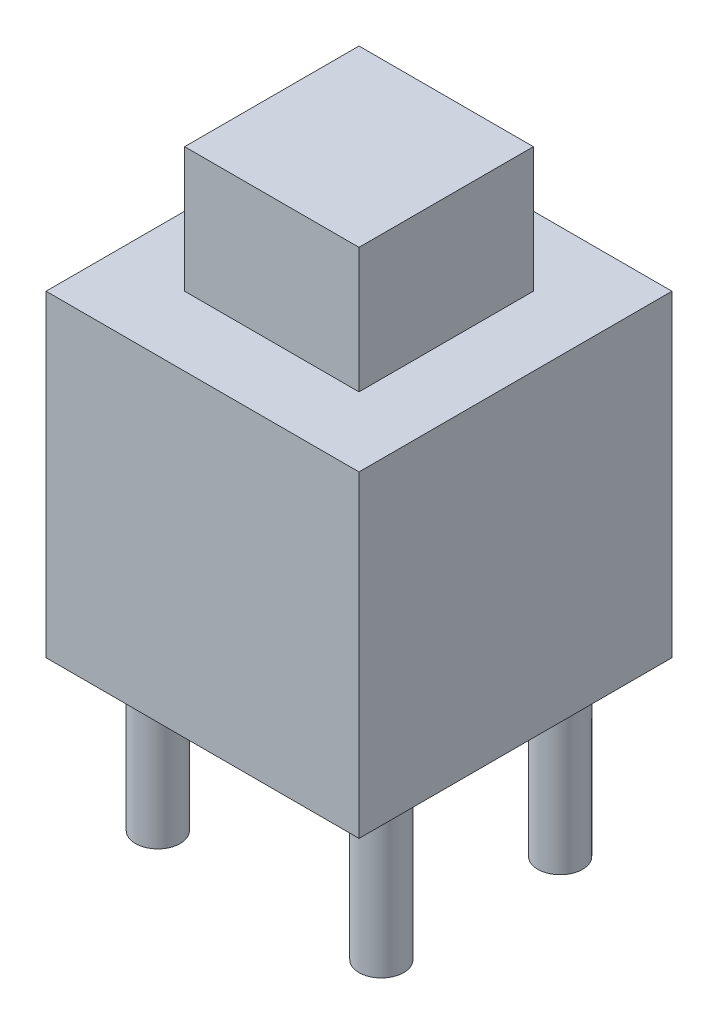
ISO-10303-21;
HEADER;
FILE_DESCRIPTION(('STEP AP214'),'2;1');
FILE_NAME('part.step','',(''),(''),'','','');
FILE_SCHEMA(('AUTOMOTIVE_DESIGN { 1 0 10303 214 1 1 1 1 }'));
ENDSEC;
DATA;
#1=APPLICATION_CONTEXT('core data for automotive mechanical design processes');
#2=APPLICATION_PROTOCOL_DEFINITION('international standard','automotive_design',2000,#1);
#3=PRODUCT_CONTEXT('',#1,'mechanical');
#4=PRODUCT('Part','Part','',(#3));
#5=PRODUCT_RELATED_PRODUCT_CATEGORY('part','',(#4));
#6=PRODUCT_DEFINITION_FORMATION('','',#4);
#7=PRODUCT_DEFINITION_CONTEXT('part definition',#1,'design');
#8=PRODUCT_DEFINITION('design','',#6,#7);
#9=PRODUCT_DEFINITION_SHAPE('','',#8);
#10=(LENGTH_UNIT() NAMED_UNIT(*) SI_UNIT(.MILLI.,.METRE.));
#11=(NAMED_UNIT(*) PLANE_ANGLE_UNIT() SI_UNIT($,.RADIAN.));
#12=(NAMED_UNIT(*) SI_UNIT($,.STERADIAN.) SOLID_ANGLE_UNIT());
#13=UNCERTAINTY_MEASURE_WITH_UNIT(LENGTH_MEASURE(1.E-05),#10,'distance_accuracy_value','');
#14=(GEOMETRIC_REPRESENTATION_CONTEXT(3) GLOBAL_UNCERTAINTY_ASSIGNED_CONTEXT((#13)) GLOBAL_UNIT_ASSIGNED_CONTEXT((#10,
#11,#12)) REPRESENTATION_CONTEXT('',''));
#15=CARTESIAN_POINT('',(0.,0.,0.));
#16=DIRECTION('',(0.,0.,1.));
#17=DIRECTION('',(1.,0.,0.));
#18=AXIS2_PLACEMENT_3D('',#15,#16,#17);
#19=CARTESIAN_POINT('',(0.,7.1,0.));
#20=DIRECTION('',(0.,-1.,0.));
#21=DIRECTION('',(0.,0.,-1.));
#22=AXIS2_PLACEMENT_3D('',#19,#20,#21);
#23=PLANE('',#22);
#24=DIRECTION('',(0.,0.,1.));
#25=VECTOR('',#24,1.);
#26=CARTESIAN_POINT('',(0.,7.1,0.));
#27=LINE('',#26,#25);
#28=CARTESIAN_POINT('',(0.,7.1,-7.));
#29=VERTEX_POINT('',#28);
#30=CARTESIAN_POINT('',(0.,7.1,0.));
#31=VERTEX_POINT('',#30);
#32=EDGE_CURVE('E133',#29,#31,#27,.T.);
#33=ORIENTED_EDGE('',*,*,#32,.T.);
#34=DIRECTION('',(1.,0.,0.));
#35=VECTOR('',#34,1.);
#36=CARTESIAN_POINT('',(0.,7.1,0.));
#37=LINE('',#36,#35);
#38=CARTESIAN_POINT('',(7.,7.1,0.));
#39=VERTEX_POINT('',#38);
#40=EDGE_CURVE('E136',#31,#39,#37,.T.);
#41=ORIENTED_EDGE('',*,*,#40,.T.);
#42=DIRECTION('',(0.,0.,-1.));
#43=VECTOR('',#42,1.);
#44=CARTESIAN_POINT('',(7.,7.1,0.));
#45=LINE('',#44,#43);
#46=CARTESIAN_POINT('',(7.,7.1,-7.));
#47=VERTEX_POINT('',#46);
#48=EDGE_CURVE('E139',#39,#47,#45,.T.);
#49=ORIENTED_EDGE('',*,*,#48,.T.);
#50=DIRECTION('',(-1.,0.,0.));
#51=VECTOR('',#50,1.);
#52=CARTESIAN_POINT('',(0.,7.1,-7.));
#53=LINE('',#52,#51);
#54=EDGE_CURVE('E141',#47,#29,#53,.T.);
#55=ORIENTED_EDGE('',*,*,#54,.T.);
#56=EDGE_LOOP('',(#33,#41,#49,#55));
#57=FACE_BOUND('',#56,.T.);
#58=DIRECTION('',(0.,0.,1.));
#59=VECTOR('',#58,1.);
#60=CARTESIAN_POINT('',(1.55,7.1,-5.45));
#61=LINE('',#60,#59);
#62=CARTESIAN_POINT('',(1.55,7.1,-5.45));
#63=VERTEX_POINT('',#62);
#64=CARTESIAN_POINT('',(1.55,7.1,-1.55));
#65=VERTEX_POINT('',#64);
#66=EDGE_CURVE('E54',#63,#65,#61,.T.);
#67=ORIENTED_EDGE('',*,*,#66,.F.);
#68=DIRECTION('',(-1.,0.,0.));
#69=VECTOR('',#68,1.);
#70=CARTESIAN_POINT('',(1.55,7.1,-5.45));
#71=LINE('',#70,#69);
#72=CARTESIAN_POINT('',(5.45,7.1,-5.45));
#73=VERTEX_POINT('',#72);
#74=EDGE_CURVE('E58',#73,#63,#71,.T.);
#75=ORIENTED_EDGE('',*,*,#74,.F.);
#76=DIRECTION('',(0.,0.,-1.));
#77=VECTOR('',#76,1.);
#78=CARTESIAN_POINT('',(5.45,7.1,-5.45));
#79=LINE('',#78,#77);
#80=CARTESIAN_POINT('',(5.45,7.1,-1.55));
#81=VERTEX_POINT('',#80);
#82=EDGE_CURVE('E414',#81,#73,#79,.T.);
#83=ORIENTED_EDGE('',*,*,#82,.F.);
#84=DIRECTION('',(1.,0.,0.));
#85=VECTOR('',#84,1.);
#86=CARTESIAN_POINT('',(1.55,7.1,-1.55));
#87=LINE('',#86,#85);
#88=EDGE_CURVE('E412',#65,#81,#87,.T.);
#89=ORIENTED_EDGE('',*,*,#88,.F.);
#90=EDGE_LOOP('',(#67,#75,#83,#89));
#91=FACE_BOUND('',#90,.T.);
#92=ADVANCED_FACE('F39',(#57,#91),#23,.F.);
#93=CARTESIAN_POINT('',(0.,7.1,0.));
#94=DIRECTION('',(1.,0.,0.));
#95=DIRECTION('',(0.,0.,-1.));
#96=AXIS2_PLACEMENT_3D('',#93,#94,#95);
#97=PLANE('',#96);
#98=DIRECTION('',(0.,0.,1.));
#99=VECTOR('',#98,1.);
#100=CARTESIAN_POINT('',(0.,0.,0.));
#101=LINE('',#100,#99);
#102=CARTESIAN_POINT('',(0.,0.,-7.));
#103=VERTEX_POINT('',#102);
#104=CARTESIAN_POINT('',(0.,0.,0.));
#105=VERTEX_POINT('',#104);
#106=EDGE_CURVE('E124',#103,#105,#101,.T.);
#107=ORIENTED_EDGE('',*,*,#106,.T.);
#108=DIRECTION('',(0.,-1.,0.));
#109=VECTOR('',#108,1.);
#110=CARTESIAN_POINT('',(0.,7.1,0.));
#111=LINE('',#110,#109);
#112=EDGE_CURVE('E11',#31,#105,#111,.T.);
#113=ORIENTED_EDGE('',*,*,#112,.F.);
#114=ORIENTED_EDGE('',*,*,#32,.F.);
#115=DIRECTION('',(0.,-1.,0.));
#116=VECTOR('',#115,1.);
#117=CARTESIAN_POINT('',(0.,7.1,-7.));
#118=LINE('',#117,#116);
#119=EDGE_CURVE('E142',#29,#103,#118,.T.);
#120=ORIENTED_EDGE('',*,*,#119,.T.);
#121=EDGE_LOOP('',(#107,#113,#114,#120));
#122=FACE_BOUND('',#121,.T.);
#123=ADVANCED_FACE('F41',(#122),#97,.F.);
#124=CARTESIAN_POINT('',(0.,7.1,0.));
#125=DIRECTION('',(0.,0.,-1.));
#126=DIRECTION('',(-1.,0.,0.));
#127=AXIS2_PLACEMENT_3D('',#124,#125,#126);
#128=PLANE('',#127);
#129=DIRECTION('',(1.,0.,0.));
#130=VECTOR('',#129,1.);
#131=CARTESIAN_POINT('',(0.,0.,0.));
#132=LINE('',#131,#130);
#133=CARTESIAN_POINT('',(7.,0.,0.));
#134=VERTEX_POINT('',#133);
#135=EDGE_CURVE('E127',#105,#134,#132,.T.);
#136=ORIENTED_EDGE('',*,*,#135,.T.);
#137=DIRECTION('',(0.,-1.,0.));
#138=VECTOR('',#137,1.);
#139=CARTESIAN_POINT('',(7.,7.1,0.));
#140=LINE('',#139,#138);
#141=EDGE_CURVE('E47',#39,#134,#140,.T.);
#142=ORIENTED_EDGE('',*,*,#141,.F.);
#143=ORIENTED_EDGE('',*,*,#40,.F.);
#144=ORIENTED_EDGE('',*,*,#112,.T.);
#145=EDGE_LOOP('',(#136,#142,#143,#144));
#146=FACE_BOUND('',#145,.T.);
#147=ADVANCED_FACE('F172',(#146),#128,.F.);
#148=CARTESIAN_POINT('',(7.,7.1,0.));
#149=DIRECTION('',(-1.,0.,0.));
#150=DIRECTION('',(0.,0.,1.));
#151=AXIS2_PLACEMENT_3D('',#148,#149,#150);
#152=PLANE('',#151);
#153=DIRECTION('',(0.,0.,-1.));
#154=VECTOR('',#153,1.);
#155=CARTESIAN_POINT('',(7.,0.,0.));
#156=LINE('',#155,#154);
#157=CARTESIAN_POINT('',(7.,0.,-7.));
#158=VERTEX_POINT('',#157);
#159=EDGE_CURVE('E145',#134,#158,#156,.T.);
#160=ORIENTED_EDGE('',*,*,#159,.T.);
#161=DIRECTION('',(0.,-1.,0.));
#162=VECTOR('',#161,1.);
#163=CARTESIAN_POINT('',(7.,7.1,-7.));
#164=LINE('',#163,#162);
#165=EDGE_CURVE('E150',#47,#158,#164,.T.);
#166=ORIENTED_EDGE('',*,*,#165,.F.);
#167=ORIENTED_EDGE('',*,*,#48,.F.);
#168=ORIENTED_EDGE('',*,*,#141,.T.);
#169=EDGE_LOOP('',(#160,#166,#167,#168));
#170=FACE_BOUND('',#169,.T.);
#171=ADVANCED_FACE('F157',(#170),#152,.F.);
#172=CARTESIAN_POINT('',(0.,7.1,-7.));
#173=DIRECTION('',(0.,0.,1.));
#174=DIRECTION('',(1.,0.,0.));
#175=AXIS2_PLACEMENT_3D('',#172,#173,#174);
#176=PLANE('',#175);
#177=DIRECTION('',(-1.,0.,0.));
#178=VECTOR('',#177,1.);
#179=CARTESIAN_POINT('',(0.,0.,-7.));
#180=LINE('',#179,#178);
#181=EDGE_CURVE('E137',#158,#103,#180,.T.);
#182=ORIENTED_EDGE('',*,*,#181,.T.);
#183=ORIENTED_EDGE('',*,*,#119,.F.);
#184=ORIENTED_EDGE('',*,*,#54,.F.);
#185=ORIENTED_EDGE('',*,*,#165,.T.);
#186=EDGE_LOOP('',(#182,#183,#184,#185));
#187=FACE_BOUND('',#186,.T.);
#188=ADVANCED_FACE('F166',(#187),#176,.F.);
#189=CARTESIAN_POINT('',(0.,0.,0.));
#190=DIRECTION('',(0.,-1.,0.));
#191=DIRECTION('',(0.,0.,-1.));
#192=AXIS2_PLACEMENT_3D('',#189,#190,#191);
#193=PLANE('',#192);
#194=CARTESIAN_POINT('',(1.,0.,-5.5));
#195=DIRECTION('',(0.,-1.,0.));
#196=DIRECTION('',(0.,0.,-1.));
#197=AXIS2_PLACEMENT_3D('',#194,#195,#196);
#198=CIRCLE('',#197,0.5);
#199=CARTESIAN_POINT('',(1.,0.,-6.));
#200=VERTEX_POINT('',#199);
#201=EDGE_CURVE('E385',#200,#200,#198,.T.);
#202=ORIENTED_EDGE('',*,*,#201,.F.);
#203=EDGE_LOOP('',(#202));
#204=FACE_BOUND('',#203,.T.);
#205=CARTESIAN_POINT('',(6.,0.,-5.5));
#206=DIRECTION('',(0.,-1.,0.));
#207=DIRECTION('',(0.,0.,-1.));
#208=AXIS2_PLACEMENT_3D('',#205,#206,#207);
#209=CIRCLE('',#208,0.500000000000002);
#210=CARTESIAN_POINT('',(6.,0.,-6.));
#211=VERTEX_POINT('',#210);
#212=EDGE_CURVE('E391',#211,#211,#209,.T.);
#213=ORIENTED_EDGE('',*,*,#212,.F.);
#214=EDGE_LOOP('',(#213));
#215=FACE_BOUND('',#214,.T.);
#216=CARTESIAN_POINT('',(6.,0.,-1.5));
#217=DIRECTION('',(0.,-1.,0.));
#218=DIRECTION('',(0.,0.,-1.));
#219=AXIS2_PLACEMENT_3D('',#216,#217,#218);
#220=CIRCLE('',#219,0.5);
#221=CARTESIAN_POINT('',(6.,0.,-2.));
#222=VERTEX_POINT('',#221);
#223=EDGE_CURVE('E397',#222,#222,#220,.T.);
#224=ORIENTED_EDGE('',*,*,#223,.F.);
#225=EDGE_LOOP('',(#224));
#226=FACE_BOUND('',#225,.T.);
#227=CARTESIAN_POINT('',(1.,0.,-1.5));
#228=DIRECTION('',(0.,-1.,0.));
#229=DIRECTION('',(0.,0.,-1.));
#230=AXIS2_PLACEMENT_3D('',#227,#228,#229);
#231=CIRCLE('',#230,0.5);
#232=CARTESIAN_POINT('',(1.,0.,-2.));
#233=VERTEX_POINT('',#232);
#234=EDGE_CURVE('E400',#233,#233,#231,.T.);
#235=ORIENTED_EDGE('',*,*,#234,.F.);
#236=EDGE_LOOP('',(#235));
#237=FACE_BOUND('',#236,.T.);
#238=ORIENTED_EDGE('',*,*,#106,.F.);
#239=ORIENTED_EDGE('',*,*,#181,.F.);
#240=ORIENTED_EDGE('',*,*,#159,.F.);
#241=ORIENTED_EDGE('',*,*,#135,.F.);
#242=EDGE_LOOP('',(#238,#239,#240,#241));
#243=FACE_BOUND('',#242,.T.);
#244=ADVANCED_FACE('F163',(#204,#215,#226,#237,#243),#193,.T.);
#245=CARTESIAN_POINT('',(1.55,9.9,-5.45));
#246=DIRECTION('',(1.,0.,0.));
#247=DIRECTION('',(0.,0.,-1.));
#248=AXIS2_PLACEMENT_3D('',#245,#246,#247);
#249=PLANE('',#248);
#250=ORIENTED_EDGE('',*,*,#66,.T.);
#251=DIRECTION('',(0.,-1.,0.));
#252=VECTOR('',#251,1.);
#253=CARTESIAN_POINT('',(1.55,9.9,-1.55));
#254=LINE('',#253,#252);
#255=CARTESIAN_POINT('',(1.55,9.9,-1.55));
#256=VERTEX_POINT('',#255);
#257=EDGE_CURVE('E107',#256,#65,#254,.T.);
#258=ORIENTED_EDGE('',*,*,#257,.F.);
#259=DIRECTION('',(0.,0.,1.));
#260=VECTOR('',#259,1.);
#261=CARTESIAN_POINT('',(1.55,9.9,-5.45));
#262=LINE('',#261,#260);
#263=CARTESIAN_POINT('',(1.55,9.9,-5.45));
#264=VERTEX_POINT('',#263);
#265=EDGE_CURVE('E113',#264,#256,#262,.T.);
#266=ORIENTED_EDGE('',*,*,#265,.F.);
#267=DIRECTION('',(0.,-1.,0.));
#268=VECTOR('',#267,1.);
#269=CARTESIAN_POINT('',(1.55,9.9,-5.45));
#270=LINE('',#269,#268);
#271=EDGE_CURVE('E410',#264,#63,#270,.T.);
#272=ORIENTED_EDGE('',*,*,#271,.T.);
#273=EDGE_LOOP('',(#250,#258,#266,#272));
#274=FACE_BOUND('',#273,.T.);
#275=ADVANCED_FACE('F123',(#274),#249,.F.);
#276=CARTESIAN_POINT('',(1.55,9.9,-1.55));
#277=DIRECTION('',(0.,0.,-1.));
#278=DIRECTION('',(-1.,0.,0.));
#279=AXIS2_PLACEMENT_3D('',#276,#277,#278);
#280=PLANE('',#279);
#281=ORIENTED_EDGE('',*,*,#88,.T.);
#282=DIRECTION('',(0.,-1.,0.));
#283=VECTOR('',#282,1.);
#284=CARTESIAN_POINT('',(5.45,9.9,-1.55));
#285=LINE('',#284,#283);
#286=CARTESIAN_POINT('',(5.45,9.9,-1.55));
#287=VERTEX_POINT('',#286);
#288=EDGE_CURVE('E109',#287,#81,#285,.T.);
#289=ORIENTED_EDGE('',*,*,#288,.F.);
#290=DIRECTION('',(1.,0.,0.));
#291=VECTOR('',#290,1.);
#292=CARTESIAN_POINT('',(1.55,9.9,-1.55));
#293=LINE('',#292,#291);
#294=EDGE_CURVE('E102',#256,#287,#293,.T.);
#295=ORIENTED_EDGE('',*,*,#294,.F.);
#296=ORIENTED_EDGE('',*,*,#257,.T.);
#297=EDGE_LOOP('',(#281,#289,#295,#296));
#298=FACE_BOUND('',#297,.T.);
#299=ADVANCED_FACE('F105',(#298),#280,.F.);
#300=CARTESIAN_POINT('',(5.45,9.9,-5.45));
#301=DIRECTION('',(-1.,0.,0.));
#302=DIRECTION('',(0.,0.,1.));
#303=AXIS2_PLACEMENT_3D('',#300,#301,#302);
#304=PLANE('',#303);
#305=ORIENTED_EDGE('',*,*,#82,.T.);
#306=DIRECTION('',(0.,-1.,0.));
#307=VECTOR('',#306,1.);
#308=CARTESIAN_POINT('',(5.45,9.9,-5.45));
#309=LINE('',#308,#307);
#310=CARTESIAN_POINT('',(5.45,9.9,-5.45));
#311=VERTEX_POINT('',#310);
#312=EDGE_CURVE('E129',#311,#73,#309,.T.);
#313=ORIENTED_EDGE('',*,*,#312,.F.);
#314=DIRECTION('',(0.,0.,-1.));
#315=VECTOR('',#314,1.);
#316=CARTESIAN_POINT('',(5.45,9.9,-5.45));
#317=LINE('',#316,#315);
#318=EDGE_CURVE('E112',#287,#311,#317,.T.);
#319=ORIENTED_EDGE('',*,*,#318,.F.);
#320=ORIENTED_EDGE('',*,*,#288,.T.);
#321=EDGE_LOOP('',(#305,#313,#319,#320));
#322=FACE_BOUND('',#321,.T.);
#323=ADVANCED_FACE('F215',(#322),#304,.F.);
#324=CARTESIAN_POINT('',(1.55,9.9,-5.45));
#325=DIRECTION('',(0.,0.,1.));
#326=DIRECTION('',(1.,0.,0.));
#327=AXIS2_PLACEMENT_3D('',#324,#325,#326);
#328=PLANE('',#327);
#329=ORIENTED_EDGE('',*,*,#74,.T.);
#330=ORIENTED_EDGE('',*,*,#271,.F.);
#331=DIRECTION('',(-1.,0.,0.));
#332=VECTOR('',#331,1.);
#333=CARTESIAN_POINT('',(1.55,9.9,-5.45));
#334=LINE('',#333,#332);
#335=EDGE_CURVE('E118',#311,#264,#334,.T.);
#336=ORIENTED_EDGE('',*,*,#335,.F.);
#337=ORIENTED_EDGE('',*,*,#312,.T.);
#338=EDGE_LOOP('',(#329,#330,#336,#337));
#339=FACE_BOUND('',#338,.T.);
#340=ADVANCED_FACE('F221',(#339),#328,.F.);
#341=CARTESIAN_POINT('',(0.,9.9,0.));
#342=DIRECTION('',(0.,1.,0.));
#343=DIRECTION('',(0.,0.,1.));
#344=AXIS2_PLACEMENT_3D('',#341,#342,#343);
#345=PLANE('',#344);
#346=ORIENTED_EDGE('',*,*,#265,.T.);
#347=ORIENTED_EDGE('',*,*,#294,.T.);
#348=ORIENTED_EDGE('',*,*,#318,.T.);
#349=ORIENTED_EDGE('',*,*,#335,.T.);
#350=EDGE_LOOP('',(#346,#347,#348,#349));
#351=FACE_BOUND('',#350,.T.);
#352=ADVANCED_FACE('F116',(#351),#345,.T.);
#353=CARTESIAN_POINT('',(1.,-3.6,-1.5));
#354=DIRECTION('',(0.,1.,0.));
#355=DIRECTION('',(0.,0.,1.));
#356=AXIS2_PLACEMENT_3D('',#353,#354,#355);
#357=CYLINDRICAL_SURFACE('',#356,0.5);
#358=CARTESIAN_POINT('',(1.,-3.6,-1.5));
#359=DIRECTION('',(0.,-1.,0.));
#360=DIRECTION('',(0.,0.,-1.));
#361=AXIS2_PLACEMENT_3D('',#358,#359,#360);
#362=CIRCLE('',#361,0.5);
#363=CARTESIAN_POINT('',(1.,-3.6,-2.));
#364=VERTEX_POINT('',#363);
#365=EDGE_CURVE('E403',#364,#364,#362,.T.);
#366=ORIENTED_EDGE('',*,*,#365,.F.);
#367=EDGE_LOOP('',(#366));
#368=FACE_BOUND('',#367,.T.);
#369=ORIENTED_EDGE('',*,*,#234,.T.);
#370=EDGE_LOOP('',(#369));
#371=FACE_BOUND('',#370,.T.);
#372=ADVANCED_FACE('F235',(#368,#371),#357,.T.);
#373=CARTESIAN_POINT('',(1.,-3.6,-1.5));
#374=DIRECTION('',(0.,-1.,0.));
#375=DIRECTION('',(0.,0.,-1.));
#376=AXIS2_PLACEMENT_3D('',#373,#374,#375);
#377=PLANE('',#376);
#378=ORIENTED_EDGE('',*,*,#365,.T.);
#379=EDGE_LOOP('',(#378));
#380=FACE_BOUND('',#379,.T.);
#381=ADVANCED_FACE('F241',(#380),#377,.T.);
#382=CARTESIAN_POINT('',(6.,-3.6,-1.5));
#383=DIRECTION('',(0.,1.,0.));
#384=DIRECTION('',(0.,0.,1.));
#385=AXIS2_PLACEMENT_3D('',#382,#383,#384);
#386=CYLINDRICAL_SURFACE('',#385,0.5);
#387=CARTESIAN_POINT('',(6.,-3.6,-1.5));
#388=DIRECTION('',(0.,-1.,0.));
#389=DIRECTION('',(0.,0.,-1.));
#390=AXIS2_PLACEMENT_3D('',#387,#388,#389);
#391=CIRCLE('',#390,0.5);
#392=CARTESIAN_POINT('',(6.,-3.6,-2.));
#393=VERTEX_POINT('',#392);
#394=EDGE_CURVE('E394',#393,#393,#391,.T.);
#395=ORIENTED_EDGE('',*,*,#394,.F.);
#396=EDGE_LOOP('',(#395));
#397=FACE_BOUND('',#396,.T.);
#398=ORIENTED_EDGE('',*,*,#223,.T.);
#399=EDGE_LOOP('',(#398));
#400=FACE_BOUND('',#399,.T.);
#401=ADVANCED_FACE('F249',(#397,#400),#386,.T.);
#402=CARTESIAN_POINT('',(6.,-3.6,-1.5));
#403=DIRECTION('',(0.,-1.,0.));
#404=DIRECTION('',(0.,0.,-1.));
#405=AXIS2_PLACEMENT_3D('',#402,#403,#404);
#406=PLANE('',#405);
#407=ORIENTED_EDGE('',*,*,#394,.T.);
#408=EDGE_LOOP('',(#407));
#409=FACE_BOUND('',#408,.T.);
#410=ADVANCED_FACE('F257',(#409),#406,.T.);
#411=CARTESIAN_POINT('',(6.,-3.6,-5.5));
#412=DIRECTION('',(0.,1.,0.));
#413=DIRECTION('',(0.,0.,1.));
#414=AXIS2_PLACEMENT_3D('',#411,#412,#413);
#415=CYLINDRICAL_SURFACE('',#414,0.500000000000002);
#416=CARTESIAN_POINT('',(6.,-3.6,-5.5));
#417=DIRECTION('',(0.,-1.,0.));
#418=DIRECTION('',(0.,0.,-1.));
#419=AXIS2_PLACEMENT_3D('',#416,#417,#418);
#420=CIRCLE('',#419,0.500000000000002);
#421=CARTESIAN_POINT('',(6.,-3.6,-6.));
#422=VERTEX_POINT('',#421);
#423=EDGE_CURVE('E388',#422,#422,#420,.T.);
#424=ORIENTED_EDGE('',*,*,#423,.F.);
#425=EDGE_LOOP('',(#424));
#426=FACE_BOUND('',#425,.T.);
#427=ORIENTED_EDGE('',*,*,#212,.T.);
#428=EDGE_LOOP('',(#427));
#429=FACE_BOUND('',#428,.T.);
#430=ADVANCED_FACE('F265',(#426,#429),#415,.T.);
#431=CARTESIAN_POINT('',(6.,-3.6,-5.5));
#432=DIRECTION('',(0.,-1.,0.));
#433=DIRECTION('',(0.,0.,-1.));
#434=AXIS2_PLACEMENT_3D('',#431,#432,#433);
#435=PLANE('',#434);
#436=ORIENTED_EDGE('',*,*,#423,.T.);
#437=EDGE_LOOP('',(#436));
#438=FACE_BOUND('',#437,.T.);
#439=ADVANCED_FACE('F273',(#438),#435,.T.);
#440=CARTESIAN_POINT('',(1.,-3.6,-5.5));
#441=DIRECTION('',(0.,1.,0.));
#442=DIRECTION('',(0.,0.,1.));
#443=AXIS2_PLACEMENT_3D('',#440,#441,#442);
#444=CYLINDRICAL_SURFACE('',#443,0.5);
#445=CARTESIAN_POINT('',(1.,-3.6,-5.5));
#446=DIRECTION('',(0.,-1.,0.));
#447=DIRECTION('',(0.,0.,-1.));
#448=AXIS2_PLACEMENT_3D('',#445,#446,#447);
#449=CIRCLE('',#448,0.5);
#450=CARTESIAN_POINT('',(1.,-3.6,-6.));
#451=VERTEX_POINT('',#450);
#452=EDGE_CURVE('E384',#451,#451,#449,.T.);
#453=ORIENTED_EDGE('',*,*,#452,.F.);
#454=EDGE_LOOP('',(#453));
#455=FACE_BOUND('',#454,.T.);
#456=ORIENTED_EDGE('',*,*,#201,.T.);
#457=EDGE_LOOP('',(#456));
#458=FACE_BOUND('',#457,.T.);
#459=ADVANCED_FACE('F281',(#455,#458),#444,.T.);
#460=CARTESIAN_POINT('',(1.,-3.6,-5.5));
#461=DIRECTION('',(0.,-1.,0.));
#462=DIRECTION('',(0.,0.,-1.));
#463=AXIS2_PLACEMENT_3D('',#460,#461,#462);
#464=PLANE('',#463);
#465=ORIENTED_EDGE('',*,*,#452,.T.);
#466=EDGE_LOOP('',(#465));
#467=FACE_BOUND('',#466,.T.);
#468=ADVANCED_FACE('F289',(#467),#464,.T.);
#469=CLOSED_SHELL('',(#92,#123,#147,#171,#188,#244,#275,#299,#323,#340,#352,#372,#381,#401,#410,
#430,#439,#459,#468));
#470=MANIFOLD_SOLID_BREP('B2',#469);
#471=ADVANCED_BREP_SHAPE_REPRESENTATION('',(#18,#470),#14);
#472=SHAPE_DEFINITION_REPRESENTATION(#9,#471);
ENDSEC;
END-ISO-10303-21;
